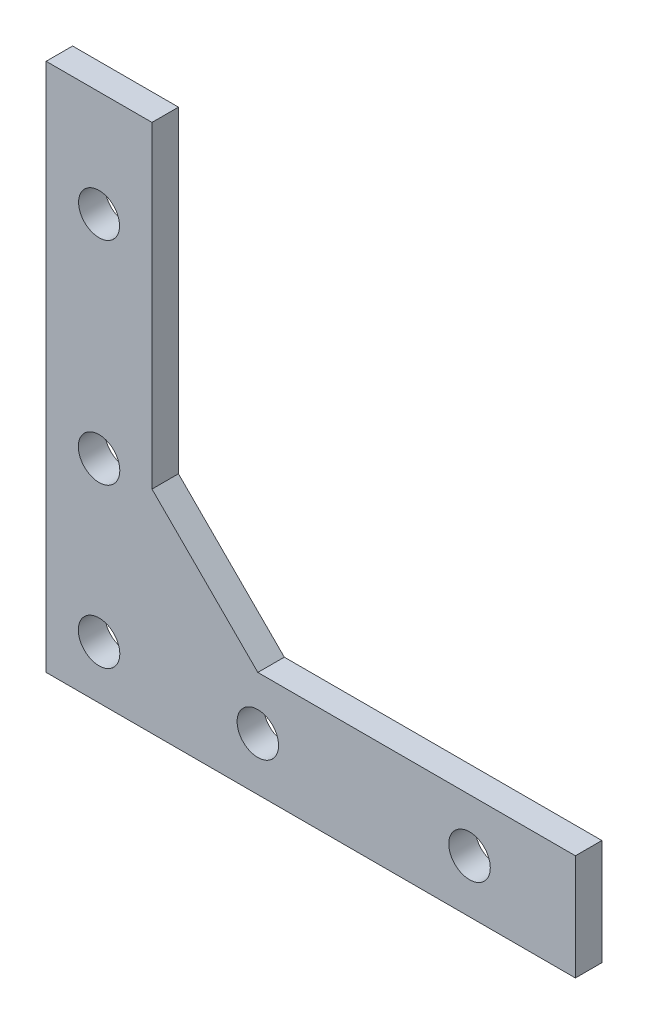
ISO-10303-21;
HEADER;
FILE_DESCRIPTION(('STEP AP214'),'2;1');
FILE_NAME('part.step','',(''),(''),'','','');
FILE_SCHEMA(('AUTOMOTIVE_DESIGN { 1 0 10303 214 1 1 1 1 }'));
ENDSEC;
DATA;
#1=APPLICATION_CONTEXT('core data for automotive mechanical design processes');
#2=APPLICATION_PROTOCOL_DEFINITION('international standard','automotive_design',2000,#1);
#3=PRODUCT_CONTEXT('',#1,'mechanical');
#4=PRODUCT('Part','Part','',(#3));
#5=PRODUCT_RELATED_PRODUCT_CATEGORY('part','',(#4));
#6=PRODUCT_DEFINITION_FORMATION('','',#4);
#7=PRODUCT_DEFINITION_CONTEXT('part definition',#1,'design');
#8=PRODUCT_DEFINITION('design','',#6,#7);
#9=PRODUCT_DEFINITION_SHAPE('','',#8);
#10=(LENGTH_UNIT() NAMED_UNIT(*) SI_UNIT(.MILLI.,.METRE.));
#11=(NAMED_UNIT(*) PLANE_ANGLE_UNIT() SI_UNIT($,.RADIAN.));
#12=(NAMED_UNIT(*) SI_UNIT($,.STERADIAN.) SOLID_ANGLE_UNIT());
#13=UNCERTAINTY_MEASURE_WITH_UNIT(LENGTH_MEASURE(1.E-05),#10,'distance_accuracy_value','');
#14=(GEOMETRIC_REPRESENTATION_CONTEXT(3) GLOBAL_UNCERTAINTY_ASSIGNED_CONTEXT((#13)) GLOBAL_UNIT_ASSIGNED_CONTEXT((#10,
#11,#12)) REPRESENTATION_CONTEXT('',''));
#15=CARTESIAN_POINT('',(0.,0.,0.));
#16=DIRECTION('',(0.,0.,1.));
#17=DIRECTION('',(1.,0.,0.));
#18=AXIS2_PLACEMENT_3D('',#15,#16,#17);
#19=CARTESIAN_POINT('',(-203.200000508,0.,3.175));
#20=DIRECTION('',(-1.,0.,0.));
#21=DIRECTION('',(0.,0.,1.));
#22=AXIS2_PLACEMENT_3D('',#19,#20,#21);
#23=PLANE('',#22);
#24=DIRECTION('',(0.,1.,0.));
#25=VECTOR('',#24,1.);
#26=CARTESIAN_POINT('',(-203.200000508,0.,0.));
#27=LINE('',#26,#25);
#28=CARTESIAN_POINT('',(-203.200000508,0.,0.));
#29=VERTEX_POINT('',#28);
#30=CARTESIAN_POINT('',(-203.200000508,12.7,0.));
#31=VERTEX_POINT('',#30);
#32=EDGE_CURVE('E146',#29,#31,#27,.T.);
#33=ORIENTED_EDGE('',*,*,#32,.T.);
#34=DIRECTION('',(0.,0.,-1.));
#35=VECTOR('',#34,1.);
#36=CARTESIAN_POINT('',(-203.200000508,12.7,3.175));
#37=LINE('',#36,#35);
#38=CARTESIAN_POINT('',(-203.200000508,12.7,3.175));
#39=VERTEX_POINT('',#38);
#40=EDGE_CURVE('E54',#39,#31,#37,.T.);
#41=ORIENTED_EDGE('',*,*,#40,.F.);
#42=DIRECTION('',(0.,1.,0.));
#43=VECTOR('',#42,1.);
#44=CARTESIAN_POINT('',(-203.200000508,0.,3.175));
#45=LINE('',#44,#43);
#46=CARTESIAN_POINT('',(-203.200000508,0.,3.175));
#47=VERTEX_POINT('',#46);
#48=EDGE_CURVE('E103',#47,#39,#45,.T.);
#49=ORIENTED_EDGE('',*,*,#48,.F.);
#50=DIRECTION('',(0.,0.,-1.));
#51=VECTOR('',#50,1.);
#52=CARTESIAN_POINT('',(-203.200000508,0.,3.175));
#53=LINE('',#52,#51);
#54=EDGE_CURVE('E11',#47,#29,#53,.T.);
#55=ORIENTED_EDGE('',*,*,#54,.T.);
#56=EDGE_LOOP('',(#33,#41,#49,#55));
#57=FACE_BOUND('',#56,.T.);
#58=ADVANCED_FACE('F45',(#57),#23,.F.);
#59=CARTESIAN_POINT('',(-203.200000508,12.7,3.175));
#60=DIRECTION('',(0.,-1.,0.));
#61=DIRECTION('',(1.,0.,0.));
#62=AXIS2_PLACEMENT_3D('',#59,#60,#61);
#63=PLANE('',#62);
#64=DIRECTION('',(-1.,0.,0.));
#65=VECTOR('',#64,1.);
#66=CARTESIAN_POINT('',(-203.200000508,12.7,0.));
#67=LINE('',#66,#65);
#68=CARTESIAN_POINT('',(-241.300000508,12.7,0.));
#69=VERTEX_POINT('',#68);
#70=EDGE_CURVE('E149',#31,#69,#67,.T.);
#71=ORIENTED_EDGE('',*,*,#70,.T.);
#72=DIRECTION('',(0.,0.,-1.));
#73=VECTOR('',#72,1.);
#74=CARTESIAN_POINT('',(-241.300000508,12.7,3.175));
#75=LINE('',#74,#73);
#76=CARTESIAN_POINT('',(-241.300000508,12.7,3.175));
#77=VERTEX_POINT('',#76);
#78=EDGE_CURVE('E171',#77,#69,#75,.T.);
#79=ORIENTED_EDGE('',*,*,#78,.F.);
#80=DIRECTION('',(-1.,0.,0.));
#81=VECTOR('',#80,1.);
#82=CARTESIAN_POINT('',(-203.200000508,12.7,3.175));
#83=LINE('',#82,#81);
#84=EDGE_CURVE('E183',#39,#77,#83,.T.);
#85=ORIENTED_EDGE('',*,*,#84,.F.);
#86=ORIENTED_EDGE('',*,*,#40,.T.);
#87=EDGE_LOOP('',(#71,#79,#85,#86));
#88=FACE_BOUND('',#87,.T.);
#89=ADVANCED_FACE('F181',(#88),#63,.F.);
#90=CARTESIAN_POINT('',(-241.300000508,12.7,3.175));
#91=DIRECTION('',(-0.707106781186545,-0.70710678118655,0.));
#92=DIRECTION('',(0.70710678118655,-0.707106781186545,0.));
#93=AXIS2_PLACEMENT_3D('',#90,#91,#92);
#94=PLANE('',#93);
#95=DIRECTION('',(-0.70710678118655,0.707106781186545,0.));
#96=VECTOR('',#95,1.);
#97=CARTESIAN_POINT('',(-241.300000508,12.7,0.));
#98=LINE('',#97,#96);
#99=CARTESIAN_POINT('',(-254.000000508,25.4,0.));
#100=VERTEX_POINT('',#99);
#101=EDGE_CURVE('E153',#69,#100,#98,.T.);
#102=ORIENTED_EDGE('',*,*,#101,.T.);
#103=DIRECTION('',(0.,0.,-1.));
#104=VECTOR('',#103,1.);
#105=CARTESIAN_POINT('',(-254.000000508,25.4,3.175));
#106=LINE('',#105,#104);
#107=CARTESIAN_POINT('',(-254.000000508,25.4,3.175));
#108=VERTEX_POINT('',#107);
#109=EDGE_CURVE('E131',#108,#100,#106,.T.);
#110=ORIENTED_EDGE('',*,*,#109,.F.);
#111=DIRECTION('',(-0.70710678118655,0.707106781186545,0.));
#112=VECTOR('',#111,1.);
#113=CARTESIAN_POINT('',(-241.300000508,12.7,3.175));
#114=LINE('',#113,#112);
#115=EDGE_CURVE('E120',#77,#108,#114,.T.);
#116=ORIENTED_EDGE('',*,*,#115,.F.);
#117=ORIENTED_EDGE('',*,*,#78,.T.);
#118=EDGE_LOOP('',(#102,#110,#116,#117));
#119=FACE_BOUND('',#118,.T.);
#120=ADVANCED_FACE('F190',(#119),#94,.F.);
#121=CARTESIAN_POINT('',(-254.000000508,25.4,3.175));
#122=DIRECTION('',(-1.,0.,0.));
#123=DIRECTION('',(0.,0.,1.));
#124=AXIS2_PLACEMENT_3D('',#121,#122,#123);
#125=PLANE('',#124);
#126=DIRECTION('',(0.,1.,0.));
#127=VECTOR('',#126,1.);
#128=CARTESIAN_POINT('',(-254.000000508,25.4,0.));
#129=LINE('',#128,#127);
#130=CARTESIAN_POINT('',(-254.000000508,63.5,0.));
#131=VERTEX_POINT('',#130);
#132=EDGE_CURVE('E129',#100,#131,#129,.T.);
#133=ORIENTED_EDGE('',*,*,#132,.T.);
#134=DIRECTION('',(0.,0.,-1.));
#135=VECTOR('',#134,1.);
#136=CARTESIAN_POINT('',(-254.000000508,63.5,3.175));
#137=LINE('',#136,#135);
#138=CARTESIAN_POINT('',(-254.000000508,63.5,3.175));
#139=VERTEX_POINT('',#138);
#140=EDGE_CURVE('E126',#139,#131,#137,.T.);
#141=ORIENTED_EDGE('',*,*,#140,.F.);
#142=DIRECTION('',(0.,1.,0.));
#143=VECTOR('',#142,1.);
#144=CARTESIAN_POINT('',(-254.000000508,25.4,3.175));
#145=LINE('',#144,#143);
#146=EDGE_CURVE('E114',#108,#139,#145,.T.);
#147=ORIENTED_EDGE('',*,*,#146,.F.);
#148=ORIENTED_EDGE('',*,*,#109,.T.);
#149=EDGE_LOOP('',(#133,#141,#147,#148));
#150=FACE_BOUND('',#149,.T.);
#151=ADVANCED_FACE('F127',(#150),#125,.F.);
#152=CARTESIAN_POINT('',(-266.700000508,63.5,3.175));
#153=DIRECTION('',(0.,-1.,0.));
#154=DIRECTION('',(0.,0.,-1.));
#155=AXIS2_PLACEMENT_3D('',#152,#153,#154);
#156=PLANE('',#155);
#157=DIRECTION('',(-1.,0.,0.));
#158=VECTOR('',#157,1.);
#159=CARTESIAN_POINT('',(-266.700000508,63.5,0.));
#160=LINE('',#159,#158);
#161=CARTESIAN_POINT('',(-266.700000508,63.5,0.));
#162=VERTEX_POINT('',#161);
#163=EDGE_CURVE('E89',#131,#162,#160,.T.);
#164=ORIENTED_EDGE('',*,*,#163,.T.);
#165=DIRECTION('',(0.,0.,-1.));
#166=VECTOR('',#165,1.);
#167=CARTESIAN_POINT('',(-266.700000508,63.5,3.175));
#168=LINE('',#167,#166);
#169=CARTESIAN_POINT('',(-266.700000508,63.5,3.175));
#170=VERTEX_POINT('',#169);
#171=EDGE_CURVE('E132',#170,#162,#168,.T.);
#172=ORIENTED_EDGE('',*,*,#171,.F.);
#173=DIRECTION('',(-1.,0.,0.));
#174=VECTOR('',#173,1.);
#175=CARTESIAN_POINT('',(-266.700000508,63.5,3.175));
#176=LINE('',#175,#174);
#177=EDGE_CURVE('E118',#139,#170,#176,.T.);
#178=ORIENTED_EDGE('',*,*,#177,.F.);
#179=ORIENTED_EDGE('',*,*,#140,.T.);
#180=EDGE_LOOP('',(#164,#172,#178,#179));
#181=FACE_BOUND('',#180,.T.);
#182=ADVANCED_FACE('F134',(#181),#156,.F.);
#183=CARTESIAN_POINT('',(-266.700000508,0.,3.175));
#184=DIRECTION('',(1.,0.,0.));
#185=DIRECTION('',(0.,1.,0.));
#186=AXIS2_PLACEMENT_3D('',#183,#184,#185);
#187=PLANE('',#186);
#188=DIRECTION('',(0.,-1.,0.));
#189=VECTOR('',#188,1.);
#190=CARTESIAN_POINT('',(-266.700000508,0.,0.));
#191=LINE('',#190,#189);
#192=CARTESIAN_POINT('',(-266.700000508,0.,0.));
#193=VERTEX_POINT('',#192);
#194=EDGE_CURVE('E96',#162,#193,#191,.T.);
#195=ORIENTED_EDGE('',*,*,#194,.T.);
#196=DIRECTION('',(0.,0.,-1.));
#197=VECTOR('',#196,1.);
#198=CARTESIAN_POINT('',(-266.700000508,0.,3.175));
#199=LINE('',#198,#197);
#200=CARTESIAN_POINT('',(-266.700000508,0.,3.175));
#201=VERTEX_POINT('',#200);
#202=EDGE_CURVE('E142',#201,#193,#199,.T.);
#203=ORIENTED_EDGE('',*,*,#202,.F.);
#204=DIRECTION('',(0.,-1.,0.));
#205=VECTOR('',#204,1.);
#206=CARTESIAN_POINT('',(-266.700000508,0.,3.175));
#207=LINE('',#206,#205);
#208=EDGE_CURVE('E137',#170,#201,#207,.T.);
#209=ORIENTED_EDGE('',*,*,#208,.F.);
#210=ORIENTED_EDGE('',*,*,#171,.T.);
#211=EDGE_LOOP('',(#195,#203,#209,#210));
#212=FACE_BOUND('',#211,.T.);
#213=ADVANCED_FACE('F276',(#212),#187,.F.);
#214=CARTESIAN_POINT('',(-253.596633499993,0.,3.175));
#215=DIRECTION('',(0.,1.,0.));
#216=DIRECTION('',(-1.,0.,0.));
#217=AXIS2_PLACEMENT_3D('',#214,#215,#216);
#218=PLANE('',#217);
#219=DIRECTION('',(1.,0.,0.));
#220=VECTOR('',#219,1.);
#221=CARTESIAN_POINT('',(-253.596633499993,0.,0.));
#222=LINE('',#221,#220);
#223=EDGE_CURVE('E162',#193,#29,#222,.T.);
#224=ORIENTED_EDGE('',*,*,#223,.T.);
#225=ORIENTED_EDGE('',*,*,#54,.F.);
#226=DIRECTION('',(1.,0.,0.));
#227=VECTOR('',#226,1.);
#228=CARTESIAN_POINT('',(-253.596633499993,0.,3.175));
#229=LINE('',#228,#227);
#230=EDGE_CURVE('E62',#201,#47,#229,.T.);
#231=ORIENTED_EDGE('',*,*,#230,.F.);
#232=ORIENTED_EDGE('',*,*,#202,.T.);
#233=EDGE_LOOP('',(#224,#225,#231,#232));
#234=FACE_BOUND('',#233,.T.);
#235=ADVANCED_FACE('F247',(#234),#218,.F.);
#236=CARTESIAN_POINT('',(0.,0.,3.175));
#237=DIRECTION('',(0.,0.,1.));
#238=DIRECTION('',(1.,0.,0.));
#239=AXIS2_PLACEMENT_3D('',#236,#237,#238);
#240=PLANE('',#239);
#241=CARTESIAN_POINT('',(-260.350000508,50.8,3.175));
#242=DIRECTION('',(0.,0.,1.));
#243=DIRECTION('',(1.,0.,0.));
#244=AXIS2_PLACEMENT_3D('',#241,#242,#243);
#245=CIRCLE('',#244,2.45744999999997);
#246=CARTESIAN_POINT('',(-257.892550508,50.8,3.175));
#247=VERTEX_POINT('',#246);
#248=EDGE_CURVE('E236',#247,#247,#245,.T.);
#249=ORIENTED_EDGE('',*,*,#248,.F.);
#250=EDGE_LOOP('',(#249));
#251=FACE_BOUND('',#250,.T.);
#252=CARTESIAN_POINT('',(-260.350000508,6.35000000000002,3.175));
#253=DIRECTION('',(0.,0.,1.));
#254=DIRECTION('',(1.,0.,0.));
#255=AXIS2_PLACEMENT_3D('',#252,#253,#254);
#256=CIRCLE('',#255,2.48919999999997);
#257=CARTESIAN_POINT('',(-257.860800508,6.35000000000002,3.175));
#258=VERTEX_POINT('',#257);
#259=EDGE_CURVE('E228',#258,#258,#256,.T.);
#260=ORIENTED_EDGE('',*,*,#259,.F.);
#261=EDGE_LOOP('',(#260));
#262=FACE_BOUND('',#261,.T.);
#263=CARTESIAN_POINT('',(-260.350000508,25.4,3.175));
#264=DIRECTION('',(0.,0.,1.));
#265=DIRECTION('',(1.,0.,0.));
#266=AXIS2_PLACEMENT_3D('',#263,#264,#265);
#267=CIRCLE('',#266,2.48919999999997);
#268=CARTESIAN_POINT('',(-257.860800508,25.4,3.175));
#269=VERTEX_POINT('',#268);
#270=EDGE_CURVE('E220',#269,#269,#267,.T.);
#271=ORIENTED_EDGE('',*,*,#270,.F.);
#272=EDGE_LOOP('',(#271));
#273=FACE_BOUND('',#272,.T.);
#274=CARTESIAN_POINT('',(-241.300000508,6.35000000000002,3.175));
#275=DIRECTION('',(0.,0.,1.));
#276=DIRECTION('',(1.,0.,0.));
#277=AXIS2_PLACEMENT_3D('',#274,#275,#276);
#278=CIRCLE('',#277,2.4892);
#279=CARTESIAN_POINT('',(-238.810800508,6.35000000000002,3.175));
#280=VERTEX_POINT('',#279);
#281=EDGE_CURVE('E212',#280,#280,#278,.T.);
#282=ORIENTED_EDGE('',*,*,#281,.F.);
#283=EDGE_LOOP('',(#282));
#284=FACE_BOUND('',#283,.T.);
#285=CARTESIAN_POINT('',(-215.900000508,6.35000000000002,3.175));
#286=DIRECTION('',(0.,0.,1.));
#287=DIRECTION('',(1.,0.,0.));
#288=AXIS2_PLACEMENT_3D('',#285,#286,#287);
#289=CIRCLE('',#288,2.4892);
#290=CARTESIAN_POINT('',(-213.410800508,6.35000000000002,3.175));
#291=VERTEX_POINT('',#290);
#292=EDGE_CURVE('E204',#291,#291,#289,.T.);
#293=ORIENTED_EDGE('',*,*,#292,.F.);
#294=EDGE_LOOP('',(#293));
#295=FACE_BOUND('',#294,.T.);
#296=ORIENTED_EDGE('',*,*,#230,.T.);
#297=ORIENTED_EDGE('',*,*,#48,.T.);
#298=ORIENTED_EDGE('',*,*,#84,.T.);
#299=ORIENTED_EDGE('',*,*,#115,.T.);
#300=ORIENTED_EDGE('',*,*,#146,.T.);
#301=ORIENTED_EDGE('',*,*,#177,.T.);
#302=ORIENTED_EDGE('',*,*,#208,.T.);
#303=EDGE_LOOP('',(#296,#297,#298,#299,#300,#301,#302));
#304=FACE_BOUND('',#303,.T.);
#305=ADVANCED_FACE('F116',(#251,#262,#273,#284,#295,#304),#240,.T.);
#306=CARTESIAN_POINT('',(0.,0.,0.));
#307=DIRECTION('',(0.,0.,1.));
#308=DIRECTION('',(1.,0.,0.));
#309=AXIS2_PLACEMENT_3D('',#306,#307,#308);
#310=PLANE('',#309);
#311=CARTESIAN_POINT('',(-260.350000508,50.8,0.));
#312=DIRECTION('',(0.,0.,1.));
#313=DIRECTION('',(1.,0.,0.));
#314=AXIS2_PLACEMENT_3D('',#311,#312,#313);
#315=CIRCLE('',#314,2.45744999999997);
#316=CARTESIAN_POINT('',(-257.892550508,50.8,0.));
#317=VERTEX_POINT('',#316);
#318=EDGE_CURVE('E232',#317,#317,#315,.T.);
#319=ORIENTED_EDGE('',*,*,#318,.T.);
#320=EDGE_LOOP('',(#319));
#321=FACE_BOUND('',#320,.T.);
#322=CARTESIAN_POINT('',(-260.350000508,6.35000000000002,0.));
#323=DIRECTION('',(0.,0.,1.));
#324=DIRECTION('',(1.,0.,0.));
#325=AXIS2_PLACEMENT_3D('',#322,#323,#324);
#326=CIRCLE('',#325,2.48920000000002);
#327=CARTESIAN_POINT('',(-257.860800508,6.35000000000002,0.));
#328=VERTEX_POINT('',#327);
#329=EDGE_CURVE('E224',#328,#328,#326,.T.);
#330=ORIENTED_EDGE('',*,*,#329,.T.);
#331=EDGE_LOOP('',(#330));
#332=FACE_BOUND('',#331,.T.);
#333=CARTESIAN_POINT('',(-260.350000508,25.4,0.));
#334=DIRECTION('',(0.,0.,1.));
#335=DIRECTION('',(1.,0.,0.));
#336=AXIS2_PLACEMENT_3D('',#333,#334,#335);
#337=CIRCLE('',#336,2.48920000000002);
#338=CARTESIAN_POINT('',(-257.860800508,25.4,0.));
#339=VERTEX_POINT('',#338);
#340=EDGE_CURVE('E216',#339,#339,#337,.T.);
#341=ORIENTED_EDGE('',*,*,#340,.T.);
#342=EDGE_LOOP('',(#341));
#343=FACE_BOUND('',#342,.T.);
#344=CARTESIAN_POINT('',(-241.300000508,6.35000000000002,0.));
#345=DIRECTION('',(0.,0.,1.));
#346=DIRECTION('',(1.,0.,0.));
#347=AXIS2_PLACEMENT_3D('',#344,#345,#346);
#348=CIRCLE('',#347,2.4892);
#349=CARTESIAN_POINT('',(-238.810800508,6.35000000000002,0.));
#350=VERTEX_POINT('',#349);
#351=EDGE_CURVE('E208',#350,#350,#348,.T.);
#352=ORIENTED_EDGE('',*,*,#351,.T.);
#353=EDGE_LOOP('',(#352));
#354=FACE_BOUND('',#353,.T.);
#355=CARTESIAN_POINT('',(-215.900000508,6.35000000000002,0.));
#356=DIRECTION('',(0.,0.,1.));
#357=DIRECTION('',(1.,0.,0.));
#358=AXIS2_PLACEMENT_3D('',#355,#356,#357);
#359=CIRCLE('',#358,2.4892);
#360=CARTESIAN_POINT('',(-213.410800508,6.35000000000002,0.));
#361=VERTEX_POINT('',#360);
#362=EDGE_CURVE('E150',#361,#361,#359,.T.);
#363=ORIENTED_EDGE('',*,*,#362,.T.);
#364=EDGE_LOOP('',(#363));
#365=FACE_BOUND('',#364,.T.);
#366=ORIENTED_EDGE('',*,*,#32,.F.);
#367=ORIENTED_EDGE('',*,*,#223,.F.);
#368=ORIENTED_EDGE('',*,*,#194,.F.);
#369=ORIENTED_EDGE('',*,*,#163,.F.);
#370=ORIENTED_EDGE('',*,*,#132,.F.);
#371=ORIENTED_EDGE('',*,*,#101,.F.);
#372=ORIENTED_EDGE('',*,*,#70,.F.);
#373=EDGE_LOOP('',(#366,#367,#368,#369,#370,#371,#372));
#374=FACE_BOUND('',#373,.T.);
#375=ADVANCED_FACE('F187',(#321,#332,#343,#354,#365,#374),#310,.F.);
#376=CARTESIAN_POINT('',(-215.900000508,6.35000000000002,3.175));
#377=DIRECTION('',(0.,0.,1.));
#378=DIRECTION('',(1.,0.,0.));
#379=AXIS2_PLACEMENT_3D('',#376,#377,#378);
#380=CYLINDRICAL_SURFACE('',#379,2.4892);
#381=ORIENTED_EDGE('',*,*,#362,.F.);
#382=EDGE_LOOP('',(#381));
#383=FACE_BOUND('',#382,.T.);
#384=ORIENTED_EDGE('',*,*,#292,.T.);
#385=EDGE_LOOP('',(#384));
#386=FACE_BOUND('',#385,.T.);
#387=ADVANCED_FACE('F257',(#383,#386),#380,.F.);
#388=CARTESIAN_POINT('',(-241.300000508,6.35000000000002,3.175));
#389=DIRECTION('',(0.,0.,1.));
#390=DIRECTION('',(1.,0.,0.));
#391=AXIS2_PLACEMENT_3D('',#388,#389,#390);
#392=CYLINDRICAL_SURFACE('',#391,2.4892);
#393=ORIENTED_EDGE('',*,*,#351,.F.);
#394=EDGE_LOOP('',(#393));
#395=FACE_BOUND('',#394,.T.);
#396=ORIENTED_EDGE('',*,*,#281,.T.);
#397=EDGE_LOOP('',(#396));
#398=FACE_BOUND('',#397,.T.);
#399=ADVANCED_FACE('F259',(#395,#398),#392,.F.);
#400=CARTESIAN_POINT('',(-260.350000508,25.4,3.175));
#401=DIRECTION('',(0.,0.,1.));
#402=DIRECTION('',(1.,0.,0.));
#403=AXIS2_PLACEMENT_3D('',#400,#401,#402);
#404=CYLINDRICAL_SURFACE('',#403,2.4892);
#405=ORIENTED_EDGE('',*,*,#340,.F.);
#406=EDGE_LOOP('',(#405));
#407=FACE_BOUND('',#406,.T.);
#408=ORIENTED_EDGE('',*,*,#270,.T.);
#409=EDGE_LOOP('',(#408));
#410=FACE_BOUND('',#409,.T.);
#411=ADVANCED_FACE('F266',(#407,#410),#404,.F.);
#412=CARTESIAN_POINT('',(-260.350000508,6.35000000000002,3.175));
#413=DIRECTION('',(0.,0.,1.));
#414=DIRECTION('',(1.,0.,0.));
#415=AXIS2_PLACEMENT_3D('',#412,#413,#414);
#416=CYLINDRICAL_SURFACE('',#415,2.4892);
#417=ORIENTED_EDGE('',*,*,#329,.F.);
#418=EDGE_LOOP('',(#417));
#419=FACE_BOUND('',#418,.T.);
#420=ORIENTED_EDGE('',*,*,#259,.T.);
#421=EDGE_LOOP('',(#420));
#422=FACE_BOUND('',#421,.T.);
#423=ADVANCED_FACE('F337',(#419,#422),#416,.F.);
#424=CARTESIAN_POINT('',(-260.350000508,50.8,3.175));
#425=DIRECTION('',(0.,0.,1.));
#426=DIRECTION('',(1.,0.,0.));
#427=AXIS2_PLACEMENT_3D('',#424,#425,#426);
#428=CYLINDRICAL_SURFACE('',#427,2.45744999999997);
#429=ORIENTED_EDGE('',*,*,#318,.F.);
#430=EDGE_LOOP('',(#429));
#431=FACE_BOUND('',#430,.T.);
#432=ORIENTED_EDGE('',*,*,#248,.T.);
#433=EDGE_LOOP('',(#432));
#434=FACE_BOUND('',#433,.T.);
#435=ADVANCED_FACE('F243',(#431,#434),#428,.F.);
#436=CLOSED_SHELL('',(#58,#89,#120,#151,#182,#213,#235,#305,#375,#387,#399,#411,#423,#435));
#437=MANIFOLD_SOLID_BREP('B2',#436);
#438=ADVANCED_BREP_SHAPE_REPRESENTATION('',(#18,#437),#14);
#439=SHAPE_DEFINITION_REPRESENTATION(#9,#438);
ENDSEC;
END-ISO-10303-21;
